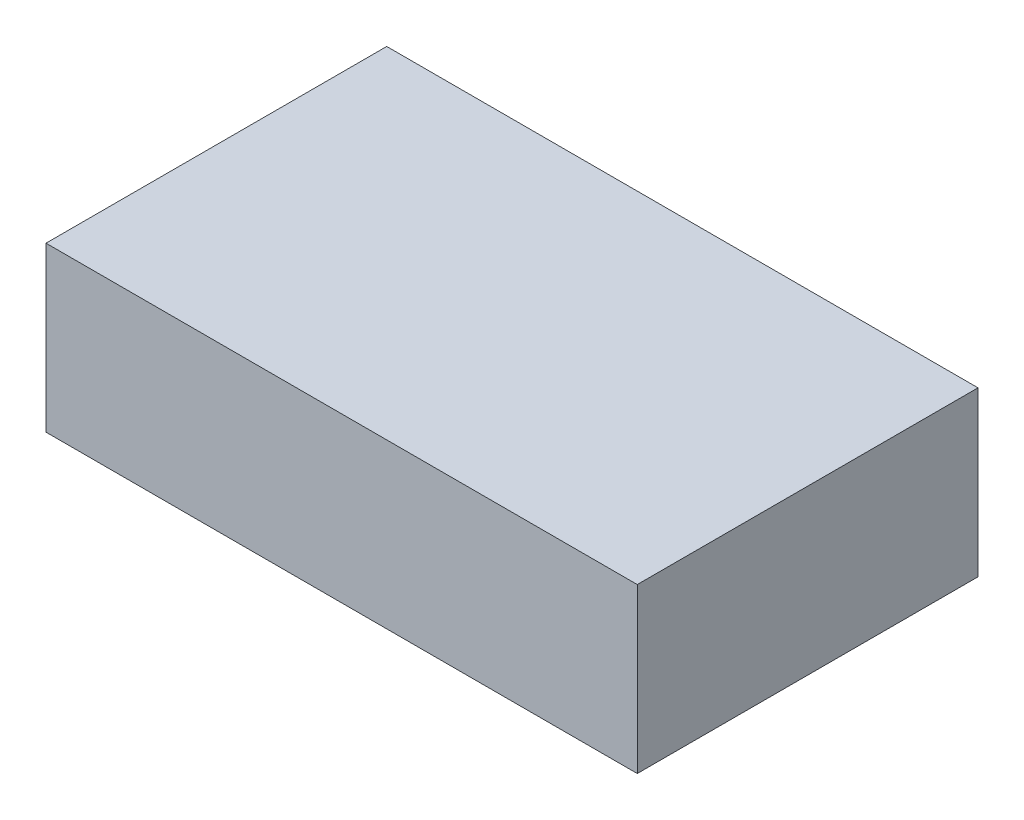
ISO-10303-21;
HEADER;
FILE_DESCRIPTION(('STEP AP214'),'2;1');
FILE_NAME('part.step','',(''),(''),'','','');
FILE_SCHEMA(('AUTOMOTIVE_DESIGN { 1 0 10303 214 1 1 1 1 }'));
ENDSEC;
DATA;
#1=APPLICATION_CONTEXT('core data for automotive mechanical design processes');
#2=APPLICATION_PROTOCOL_DEFINITION('international standard','automotive_design',2000,#1);
#3=PRODUCT_CONTEXT('',#1,'mechanical');
#4=PRODUCT('Part','Part','',(#3));
#5=PRODUCT_RELATED_PRODUCT_CATEGORY('part','',(#4));
#6=PRODUCT_DEFINITION_FORMATION('','',#4);
#7=PRODUCT_DEFINITION_CONTEXT('part definition',#1,'design');
#8=PRODUCT_DEFINITION('design','',#6,#7);
#9=PRODUCT_DEFINITION_SHAPE('','',#8);
#10=(LENGTH_UNIT() NAMED_UNIT(*) SI_UNIT(.MILLI.,.METRE.));
#11=(NAMED_UNIT(*) PLANE_ANGLE_UNIT() SI_UNIT($,.RADIAN.));
#12=(NAMED_UNIT(*) SI_UNIT($,.STERADIAN.) SOLID_ANGLE_UNIT());
#13=UNCERTAINTY_MEASURE_WITH_UNIT(LENGTH_MEASURE(1.E-05),#10,'distance_accuracy_value','');
#14=(GEOMETRIC_REPRESENTATION_CONTEXT(3) GLOBAL_UNCERTAINTY_ASSIGNED_CONTEXT((#13)) GLOBAL_UNIT_ASSIGNED_CONTEXT((#10,
#11,#12)) REPRESENTATION_CONTEXT('',''));
#15=CARTESIAN_POINT('',(0.,0.,0.));
#16=DIRECTION('',(0.,0.,1.));
#17=DIRECTION('',(1.,0.,0.));
#18=AXIS2_PLACEMENT_3D('',#15,#16,#17);
#19=CARTESIAN_POINT('',(88.5,49.,51.));
#20=DIRECTION('',(-1.,0.,0.));
#21=DIRECTION('',(0.,0.,1.));
#22=AXIS2_PLACEMENT_3D('',#19,#20,#21);
#23=PLANE('',#22);
#24=DIRECTION('',(0.,0.,-1.));
#25=VECTOR('',#24,1.);
#26=CARTESIAN_POINT('',(88.5,0.,51.));
#27=LINE('',#26,#25);
#28=CARTESIAN_POINT('',(88.5,0.,51.));
#29=VERTEX_POINT('',#28);
#30=CARTESIAN_POINT('',(88.5,0.,-51.));
#31=VERTEX_POINT('',#30);
#32=EDGE_CURVE('E107',#29,#31,#27,.T.);
#33=ORIENTED_EDGE('',*,*,#32,.T.);
#34=DIRECTION('',(0.,-1.,0.));
#35=VECTOR('',#34,1.);
#36=CARTESIAN_POINT('',(88.5,49.,-51.));
#37=LINE('',#36,#35);
#38=CARTESIAN_POINT('',(88.5,49.,-51.));
#39=VERTEX_POINT('',#38);
#40=EDGE_CURVE('E11',#39,#31,#37,.T.);
#41=ORIENTED_EDGE('',*,*,#40,.F.);
#42=DIRECTION('',(0.,0.,-1.));
#43=VECTOR('',#42,1.);
#44=CARTESIAN_POINT('',(88.5,49.,51.));
#45=LINE('',#44,#43);
#46=CARTESIAN_POINT('',(88.5,49.,51.));
#47=VERTEX_POINT('',#46);
#48=EDGE_CURVE('E91',#47,#39,#45,.T.);
#49=ORIENTED_EDGE('',*,*,#48,.F.);
#50=DIRECTION('',(0.,-1.,0.));
#51=VECTOR('',#50,1.);
#52=CARTESIAN_POINT('',(88.5,49.,51.));
#53=LINE('',#52,#51);
#54=EDGE_CURVE('E103',#47,#29,#53,.T.);
#55=ORIENTED_EDGE('',*,*,#54,.T.);
#56=EDGE_LOOP('',(#33,#41,#49,#55));
#57=FACE_BOUND('',#56,.T.);
#58=ADVANCED_FACE('F39',(#57),#23,.F.);
#59=CARTESIAN_POINT('',(-88.5,49.,-51.));
#60=DIRECTION('',(0.,0.,1.));
#61=DIRECTION('',(1.,0.,0.));
#62=AXIS2_PLACEMENT_3D('',#59,#60,#61);
#63=PLANE('',#62);
#64=DIRECTION('',(-1.,0.,0.));
#65=VECTOR('',#64,1.);
#66=CARTESIAN_POINT('',(-88.5,0.,-51.));
#67=LINE('',#66,#65);
#68=CARTESIAN_POINT('',(-88.5,0.,-51.));
#69=VERTEX_POINT('',#68);
#70=EDGE_CURVE('E96',#31,#69,#67,.T.);
#71=ORIENTED_EDGE('',*,*,#70,.T.);
#72=DIRECTION('',(0.,-1.,0.));
#73=VECTOR('',#72,1.);
#74=CARTESIAN_POINT('',(-88.5,49.,-51.));
#75=LINE('',#74,#73);
#76=CARTESIAN_POINT('',(-88.5,49.,-51.));
#77=VERTEX_POINT('',#76);
#78=EDGE_CURVE('E48',#77,#69,#75,.T.);
#79=ORIENTED_EDGE('',*,*,#78,.F.);
#80=DIRECTION('',(-1.,0.,0.));
#81=VECTOR('',#80,1.);
#82=CARTESIAN_POINT('',(-88.5,49.,-51.));
#83=LINE('',#82,#81);
#84=EDGE_CURVE('E86',#39,#77,#83,.T.);
#85=ORIENTED_EDGE('',*,*,#84,.F.);
#86=ORIENTED_EDGE('',*,*,#40,.T.);
#87=EDGE_LOOP('',(#71,#79,#85,#86));
#88=FACE_BOUND('',#87,.T.);
#89=ADVANCED_FACE('F95',(#88),#63,.F.);
#90=CARTESIAN_POINT('',(-88.5,49.,51.));
#91=DIRECTION('',(1.,0.,0.));
#92=DIRECTION('',(0.,0.,-1.));
#93=AXIS2_PLACEMENT_3D('',#90,#91,#92);
#94=PLANE('',#93);
#95=DIRECTION('',(0.,0.,1.));
#96=VECTOR('',#95,1.);
#97=CARTESIAN_POINT('',(-88.5,0.,51.));
#98=LINE('',#97,#96);
#99=CARTESIAN_POINT('',(-88.5,0.,51.));
#100=VERTEX_POINT('',#99);
#101=EDGE_CURVE('E73',#69,#100,#98,.T.);
#102=ORIENTED_EDGE('',*,*,#101,.T.);
#103=DIRECTION('',(0.,-1.,0.));
#104=VECTOR('',#103,1.);
#105=CARTESIAN_POINT('',(-88.5,49.,51.));
#106=LINE('',#105,#104);
#107=CARTESIAN_POINT('',(-88.5,49.,51.));
#108=VERTEX_POINT('',#107);
#109=EDGE_CURVE('E98',#108,#100,#106,.T.);
#110=ORIENTED_EDGE('',*,*,#109,.F.);
#111=DIRECTION('',(0.,0.,1.));
#112=VECTOR('',#111,1.);
#113=CARTESIAN_POINT('',(-88.5,49.,51.));
#114=LINE('',#113,#112);
#115=EDGE_CURVE('E89',#77,#108,#114,.T.);
#116=ORIENTED_EDGE('',*,*,#115,.F.);
#117=ORIENTED_EDGE('',*,*,#78,.T.);
#118=EDGE_LOOP('',(#102,#110,#116,#117));
#119=FACE_BOUND('',#118,.T.);
#120=ADVANCED_FACE('F99',(#119),#94,.F.);
#121=CARTESIAN_POINT('',(-88.5,49.,51.));
#122=DIRECTION('',(0.,0.,-1.));
#123=DIRECTION('',(-1.,0.,0.));
#124=AXIS2_PLACEMENT_3D('',#121,#122,#123);
#125=PLANE('',#124);
#126=DIRECTION('',(1.,0.,0.));
#127=VECTOR('',#126,1.);
#128=CARTESIAN_POINT('',(-88.5,0.,51.));
#129=LINE('',#128,#127);
#130=EDGE_CURVE('E79',#100,#29,#129,.T.);
#131=ORIENTED_EDGE('',*,*,#130,.T.);
#132=ORIENTED_EDGE('',*,*,#54,.F.);
#133=DIRECTION('',(1.,0.,0.));
#134=VECTOR('',#133,1.);
#135=CARTESIAN_POINT('',(-88.5,49.,51.));
#136=LINE('',#135,#134);
#137=EDGE_CURVE('E56',#108,#47,#136,.T.);
#138=ORIENTED_EDGE('',*,*,#137,.F.);
#139=ORIENTED_EDGE('',*,*,#109,.T.);
#140=EDGE_LOOP('',(#131,#132,#138,#139));
#141=FACE_BOUND('',#140,.T.);
#142=ADVANCED_FACE('F120',(#141),#125,.F.);
#143=CARTESIAN_POINT('',(0.,49.,0.));
#144=DIRECTION('',(0.,-1.,0.));
#145=DIRECTION('',(0.,0.,-1.));
#146=AXIS2_PLACEMENT_3D('',#143,#144,#145);
#147=PLANE('',#146);
#148=ORIENTED_EDGE('',*,*,#48,.T.);
#149=ORIENTED_EDGE('',*,*,#84,.T.);
#150=ORIENTED_EDGE('',*,*,#115,.T.);
#151=ORIENTED_EDGE('',*,*,#137,.T.);
#152=EDGE_LOOP('',(#148,#149,#150,#151));
#153=FACE_BOUND('',#152,.T.);
#154=ADVANCED_FACE('F87',(#153),#147,.F.);
#155=CARTESIAN_POINT('',(0.,0.,0.));
#156=DIRECTION('',(0.,-1.,0.));
#157=DIRECTION('',(0.,0.,-1.));
#158=AXIS2_PLACEMENT_3D('',#155,#156,#157);
#159=PLANE('',#158);
#160=ORIENTED_EDGE('',*,*,#32,.F.);
#161=ORIENTED_EDGE('',*,*,#130,.F.);
#162=ORIENTED_EDGE('',*,*,#101,.F.);
#163=ORIENTED_EDGE('',*,*,#70,.F.);
#164=EDGE_LOOP('',(#160,#161,#162,#163));
#165=FACE_BOUND('',#164,.T.);
#166=ADVANCED_FACE('F123',(#165),#159,.T.);
#167=CLOSED_SHELL('',(#58,#89,#120,#142,#154,#166));
#168=MANIFOLD_SOLID_BREP('B2',#167);
#169=ADVANCED_BREP_SHAPE_REPRESENTATION('',(#18,#168),#14);
#170=SHAPE_DEFINITION_REPRESENTATION(#9,#169);
ENDSEC;
END-ISO-10303-21;
